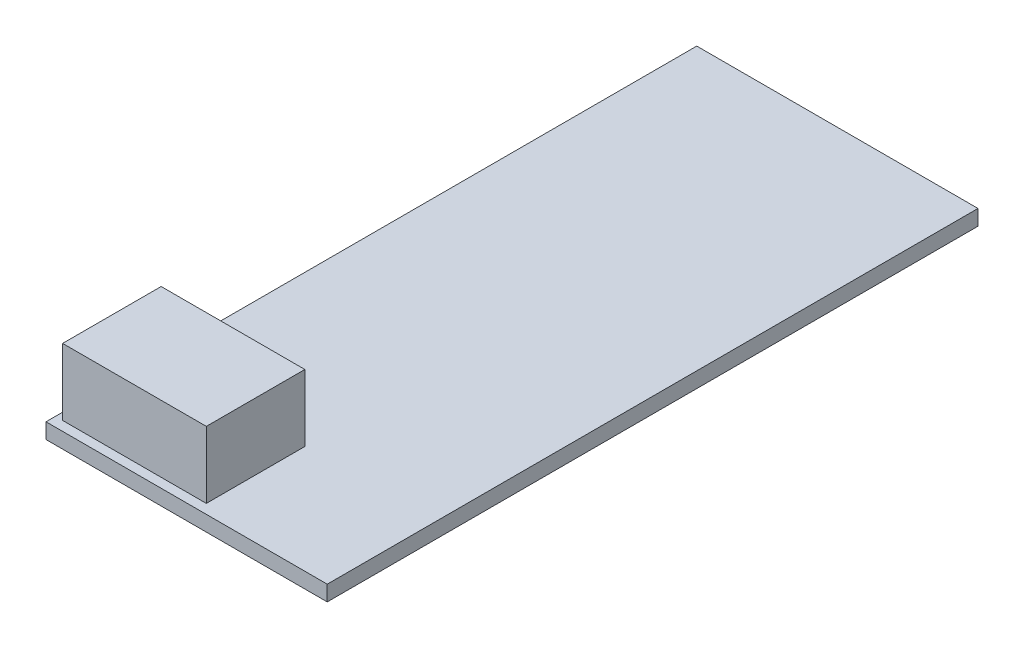
ISO-10303-21;
HEADER;
FILE_DESCRIPTION(('STEP AP214'),'2;1');
FILE_NAME('part.step','',(''),(''),'','','');
FILE_SCHEMA(('AUTOMOTIVE_DESIGN { 1 0 10303 214 1 1 1 1 }'));
ENDSEC;
DATA;
#1=APPLICATION_CONTEXT('core data for automotive mechanical design processes');
#2=APPLICATION_PROTOCOL_DEFINITION('international standard','automotive_design',2000,#1);
#3=PRODUCT_CONTEXT('',#1,'mechanical');
#4=PRODUCT('Part','Part','',(#3));
#5=PRODUCT_RELATED_PRODUCT_CATEGORY('part','',(#4));
#6=PRODUCT_DEFINITION_FORMATION('','',#4);
#7=PRODUCT_DEFINITION_CONTEXT('part definition',#1,'design');
#8=PRODUCT_DEFINITION('design','',#6,#7);
#9=PRODUCT_DEFINITION_SHAPE('','',#8);
#10=(LENGTH_UNIT() NAMED_UNIT(*) SI_UNIT(.MILLI.,.METRE.));
#11=(NAMED_UNIT(*) PLANE_ANGLE_UNIT() SI_UNIT($,.RADIAN.));
#12=(NAMED_UNIT(*) SI_UNIT($,.STERADIAN.) SOLID_ANGLE_UNIT());
#13=UNCERTAINTY_MEASURE_WITH_UNIT(LENGTH_MEASURE(1.E-05),#10,'distance_accuracy_value','');
#14=(GEOMETRIC_REPRESENTATION_CONTEXT(3) GLOBAL_UNCERTAINTY_ASSIGNED_CONTEXT((#13)) GLOBAL_UNIT_ASSIGNED_CONTEXT((#10,
#11,#12)) REPRESENTATION_CONTEXT('',''));
#15=CARTESIAN_POINT('',(0.,0.,0.));
#16=DIRECTION('',(0.,0.,1.));
#17=DIRECTION('',(1.,0.,0.));
#18=AXIS2_PLACEMENT_3D('',#15,#16,#17);
#19=CARTESIAN_POINT('',(0.,1.5,0.));
#20=DIRECTION('',(0.,-1.,0.));
#21=DIRECTION('',(0.,0.,-1.));
#22=AXIS2_PLACEMENT_3D('',#19,#20,#21);
#23=PLANE('',#22);
#24=DIRECTION('',(0.,0.,-1.));
#25=VECTOR('',#24,1.);
#26=CARTESIAN_POINT('',(13.7,1.5,31.7));
#27=LINE('',#26,#25);
#28=CARTESIAN_POINT('',(13.7,1.5,31.7));
#29=VERTEX_POINT('',#28);
#30=CARTESIAN_POINT('',(13.7,1.5,-31.7));
#31=VERTEX_POINT('',#30);
#32=EDGE_CURVE('E156',#29,#31,#27,.T.);
#33=ORIENTED_EDGE('',*,*,#32,.T.);
#34=DIRECTION('',(-1.,0.,0.));
#35=VECTOR('',#34,1.);
#36=CARTESIAN_POINT('',(-13.7,1.5,-31.7));
#37=LINE('',#36,#35);
#38=CARTESIAN_POINT('',(-13.7,1.5,-31.7));
#39=VERTEX_POINT('',#38);
#40=EDGE_CURVE('E160',#31,#39,#37,.T.);
#41=ORIENTED_EDGE('',*,*,#40,.T.);
#42=DIRECTION('',(0.,0.,1.));
#43=VECTOR('',#42,1.);
#44=CARTESIAN_POINT('',(-13.7,1.5,31.7));
#45=LINE('',#44,#43);
#46=CARTESIAN_POINT('',(-13.7,1.5,31.7));
#47=VERTEX_POINT('',#46);
#48=EDGE_CURVE('E164',#39,#47,#45,.T.);
#49=ORIENTED_EDGE('',*,*,#48,.T.);
#50=DIRECTION('',(1.,0.,0.));
#51=VECTOR('',#50,1.);
#52=CARTESIAN_POINT('',(-13.7,1.5,31.7));
#53=LINE('',#52,#51);
#54=EDGE_CURVE('E167',#47,#29,#53,.T.);
#55=ORIENTED_EDGE('',*,*,#54,.T.);
#56=EDGE_LOOP('',(#33,#41,#49,#55));
#57=FACE_BOUND('',#56,.T.);
#58=DIRECTION('',(0.,0.,-1.));
#59=VECTOR('',#58,1.);
#60=CARTESIAN_POINT('',(0.995538820845523,1.5,30.7761223841347));
#61=LINE('',#60,#59);
#62=CARTESIAN_POINT('',(0.995538820845523,1.5,30.7761223841347));
#63=VERTEX_POINT('',#62);
#64=CARTESIAN_POINT('',(0.995538820845523,1.5,21.1761223841347));
#65=VERTEX_POINT('',#64);
#66=EDGE_CURVE('E142',#63,#65,#61,.T.);
#67=ORIENTED_EDGE('',*,*,#66,.F.);
#68=DIRECTION('',(1.,0.,0.));
#69=VECTOR('',#68,1.);
#70=CARTESIAN_POINT('',(-13.0044611791545,1.5,30.7761223841347));
#71=LINE('',#70,#69);
#72=CARTESIAN_POINT('',(-13.0044611791545,1.5,30.7761223841347));
#73=VERTEX_POINT('',#72);
#74=EDGE_CURVE('E139',#73,#63,#71,.T.);
#75=ORIENTED_EDGE('',*,*,#74,.F.);
#76=DIRECTION('',(0.,0.,1.));
#77=VECTOR('',#76,1.);
#78=CARTESIAN_POINT('',(-13.0044611791545,1.5,30.7761223841347));
#79=LINE('',#78,#77);
#80=CARTESIAN_POINT('',(-13.0044611791545,1.5,21.1761223841347));
#81=VERTEX_POINT('',#80);
#82=EDGE_CURVE('E62',#81,#73,#79,.T.);
#83=ORIENTED_EDGE('',*,*,#82,.F.);
#84=DIRECTION('',(-1.,0.,0.));
#85=VECTOR('',#84,1.);
#86=CARTESIAN_POINT('',(-13.0044611791545,1.5,21.1761223841347));
#87=LINE('',#86,#85);
#88=EDGE_CURVE('E57',#65,#81,#87,.T.);
#89=ORIENTED_EDGE('',*,*,#88,.F.);
#90=EDGE_LOOP('',(#67,#75,#83,#89));
#91=FACE_BOUND('',#90,.T.);
#92=ADVANCED_FACE('F38',(#57,#91),#23,.F.);
#93=CARTESIAN_POINT('',(13.7,1.5,31.7));
#94=DIRECTION('',(-1.,0.,0.));
#95=DIRECTION('',(0.,0.,1.));
#96=AXIS2_PLACEMENT_3D('',#93,#94,#95);
#97=PLANE('',#96);
#98=DIRECTION('',(0.,0.,-1.));
#99=VECTOR('',#98,1.);
#100=CARTESIAN_POINT('',(13.7,0.,31.7));
#101=LINE('',#100,#99);
#102=CARTESIAN_POINT('',(13.7,0.,31.7));
#103=VERTEX_POINT('',#102);
#104=CARTESIAN_POINT('',(13.7,0.,-31.7));
#105=VERTEX_POINT('',#104);
#106=EDGE_CURVE('E144',#103,#105,#101,.T.);
#107=ORIENTED_EDGE('',*,*,#106,.T.);
#108=DIRECTION('',(0.,-1.,0.));
#109=VECTOR('',#108,1.);
#110=CARTESIAN_POINT('',(13.7,1.5,-31.7));
#111=LINE('',#110,#109);
#112=EDGE_CURVE('E11',#31,#105,#111,.T.);
#113=ORIENTED_EDGE('',*,*,#112,.F.);
#114=ORIENTED_EDGE('',*,*,#32,.F.);
#115=DIRECTION('',(0.,-1.,0.));
#116=VECTOR('',#115,1.);
#117=CARTESIAN_POINT('',(13.7,1.5,31.7));
#118=LINE('',#117,#116);
#119=EDGE_CURVE('E169',#29,#103,#118,.T.);
#120=ORIENTED_EDGE('',*,*,#119,.T.);
#121=EDGE_LOOP('',(#107,#113,#114,#120));
#122=FACE_BOUND('',#121,.T.);
#123=ADVANCED_FACE('F40',(#122),#97,.F.);
#124=CARTESIAN_POINT('',(-13.7,1.5,-31.7));
#125=DIRECTION('',(0.,0.,1.));
#126=DIRECTION('',(1.,0.,0.));
#127=AXIS2_PLACEMENT_3D('',#124,#125,#126);
#128=PLANE('',#127);
#129=DIRECTION('',(-1.,0.,0.));
#130=VECTOR('',#129,1.);
#131=CARTESIAN_POINT('',(-13.7,0.,-31.7));
#132=LINE('',#131,#130);
#133=CARTESIAN_POINT('',(-13.7,0.,-31.7));
#134=VERTEX_POINT('',#133);
#135=EDGE_CURVE('E150',#105,#134,#132,.T.);
#136=ORIENTED_EDGE('',*,*,#135,.T.);
#137=DIRECTION('',(0.,-1.,0.));
#138=VECTOR('',#137,1.);
#139=CARTESIAN_POINT('',(-13.7,1.5,-31.7));
#140=LINE('',#139,#138);
#141=EDGE_CURVE('E47',#39,#134,#140,.T.);
#142=ORIENTED_EDGE('',*,*,#141,.F.);
#143=ORIENTED_EDGE('',*,*,#40,.F.);
#144=ORIENTED_EDGE('',*,*,#112,.T.);
#145=EDGE_LOOP('',(#136,#142,#143,#144));
#146=FACE_BOUND('',#145,.T.);
#147=ADVANCED_FACE('F205',(#146),#128,.F.);
#148=CARTESIAN_POINT('',(-13.7,1.5,31.7));
#149=DIRECTION('',(1.,0.,0.));
#150=DIRECTION('',(0.,0.,-1.));
#151=AXIS2_PLACEMENT_3D('',#148,#149,#150);
#152=PLANE('',#151);
#153=DIRECTION('',(0.,0.,1.));
#154=VECTOR('',#153,1.);
#155=CARTESIAN_POINT('',(-13.7,0.,31.7));
#156=LINE('',#155,#154);
#157=CARTESIAN_POINT('',(-13.7,0.,31.7));
#158=VERTEX_POINT('',#157);
#159=EDGE_CURVE('E173',#134,#158,#156,.T.);
#160=ORIENTED_EDGE('',*,*,#159,.T.);
#161=DIRECTION('',(0.,-1.,0.));
#162=VECTOR('',#161,1.);
#163=CARTESIAN_POINT('',(-13.7,1.5,31.7));
#164=LINE('',#163,#162);
#165=EDGE_CURVE('E181',#47,#158,#164,.T.);
#166=ORIENTED_EDGE('',*,*,#165,.F.);
#167=ORIENTED_EDGE('',*,*,#48,.F.);
#168=ORIENTED_EDGE('',*,*,#141,.T.);
#169=EDGE_LOOP('',(#160,#166,#167,#168));
#170=FACE_BOUND('',#169,.T.);
#171=ADVANCED_FACE('F190',(#170),#152,.F.);
#172=CARTESIAN_POINT('',(-13.7,1.5,31.7));
#173=DIRECTION('',(0.,0.,-1.));
#174=DIRECTION('',(-1.,0.,0.));
#175=AXIS2_PLACEMENT_3D('',#172,#173,#174);
#176=PLANE('',#175);
#177=DIRECTION('',(1.,0.,0.));
#178=VECTOR('',#177,1.);
#179=CARTESIAN_POINT('',(-13.7,0.,31.7));
#180=LINE('',#179,#178);
#181=EDGE_CURVE('E161',#158,#103,#180,.T.);
#182=ORIENTED_EDGE('',*,*,#181,.T.);
#183=ORIENTED_EDGE('',*,*,#119,.F.);
#184=ORIENTED_EDGE('',*,*,#54,.F.);
#185=ORIENTED_EDGE('',*,*,#165,.T.);
#186=EDGE_LOOP('',(#182,#183,#184,#185));
#187=FACE_BOUND('',#186,.T.);
#188=ADVANCED_FACE('F199',(#187),#176,.F.);
#189=CARTESIAN_POINT('',(0.,0.,0.));
#190=DIRECTION('',(0.,-1.,0.));
#191=DIRECTION('',(0.,0.,-1.));
#192=AXIS2_PLACEMENT_3D('',#189,#190,#191);
#193=PLANE('',#192);
#194=ORIENTED_EDGE('',*,*,#106,.F.);
#195=ORIENTED_EDGE('',*,*,#181,.F.);
#196=ORIENTED_EDGE('',*,*,#159,.F.);
#197=ORIENTED_EDGE('',*,*,#135,.F.);
#198=EDGE_LOOP('',(#194,#195,#196,#197));
#199=FACE_BOUND('',#198,.T.);
#200=ADVANCED_FACE('F196',(#199),#193,.T.);
#201=CARTESIAN_POINT('',(0.995538820845523,8.,30.7761223841347));
#202=DIRECTION('',(-1.,0.,0.));
#203=DIRECTION('',(0.,0.,1.));
#204=AXIS2_PLACEMENT_3D('',#201,#202,#203);
#205=PLANE('',#204);
#206=ORIENTED_EDGE('',*,*,#66,.T.);
#207=DIRECTION('',(0.,-1.,0.));
#208=VECTOR('',#207,1.);
#209=CARTESIAN_POINT('',(0.995538820845523,8.,21.1761223841347));
#210=LINE('',#209,#208);
#211=CARTESIAN_POINT('',(0.995538820845523,8.,21.1761223841347));
#212=VERTEX_POINT('',#211);
#213=EDGE_CURVE('E121',#212,#65,#210,.T.);
#214=ORIENTED_EDGE('',*,*,#213,.F.);
#215=DIRECTION('',(0.,0.,-1.));
#216=VECTOR('',#215,1.);
#217=CARTESIAN_POINT('',(0.995538820845523,8.,30.7761223841347));
#218=LINE('',#217,#216);
#219=CARTESIAN_POINT('',(0.995538820845523,8.,30.7761223841347));
#220=VERTEX_POINT('',#219);
#221=EDGE_CURVE('E129',#220,#212,#218,.T.);
#222=ORIENTED_EDGE('',*,*,#221,.F.);
#223=DIRECTION('',(0.,-1.,0.));
#224=VECTOR('',#223,1.);
#225=CARTESIAN_POINT('',(0.995538820845523,8.,30.7761223841347));
#226=LINE('',#225,#224);
#227=EDGE_CURVE('E307',#220,#63,#226,.T.);
#228=ORIENTED_EDGE('',*,*,#227,.T.);
#229=EDGE_LOOP('',(#206,#214,#222,#228));
#230=FACE_BOUND('',#229,.T.);
#231=ADVANCED_FACE('F141',(#230),#205,.F.);
#232=CARTESIAN_POINT('',(-13.0044611791545,8.,21.1761223841347));
#233=DIRECTION('',(0.,0.,1.));
#234=DIRECTION('',(1.,0.,0.));
#235=AXIS2_PLACEMENT_3D('',#232,#233,#234);
#236=PLANE('',#235);
#237=ORIENTED_EDGE('',*,*,#88,.T.);
#238=DIRECTION('',(0.,-1.,0.));
#239=VECTOR('',#238,1.);
#240=CARTESIAN_POINT('',(-13.0044611791545,8.,21.1761223841347));
#241=LINE('',#240,#239);
#242=CARTESIAN_POINT('',(-13.0044611791545,8.,21.1761223841347));
#243=VERTEX_POINT('',#242);
#244=EDGE_CURVE('E124',#243,#81,#241,.T.);
#245=ORIENTED_EDGE('',*,*,#244,.F.);
#246=DIRECTION('',(-1.,0.,0.));
#247=VECTOR('',#246,1.);
#248=CARTESIAN_POINT('',(-13.0044611791545,8.,21.1761223841347));
#249=LINE('',#248,#247);
#250=EDGE_CURVE('E117',#212,#243,#249,.T.);
#251=ORIENTED_EDGE('',*,*,#250,.F.);
#252=ORIENTED_EDGE('',*,*,#213,.T.);
#253=EDGE_LOOP('',(#237,#245,#251,#252));
#254=FACE_BOUND('',#253,.T.);
#255=ADVANCED_FACE('F119',(#254),#236,.F.);
#256=CARTESIAN_POINT('',(-13.0044611791545,8.,30.7761223841347));
#257=DIRECTION('',(1.,0.,0.));
#258=DIRECTION('',(0.,0.,-1.));
#259=AXIS2_PLACEMENT_3D('',#256,#257,#258);
#260=PLANE('',#259);
#261=ORIENTED_EDGE('',*,*,#82,.T.);
#262=DIRECTION('',(0.,-1.,0.));
#263=VECTOR('',#262,1.);
#264=CARTESIAN_POINT('',(-13.0044611791545,8.,30.7761223841347));
#265=LINE('',#264,#263);
#266=CARTESIAN_POINT('',(-13.0044611791545,8.,30.7761223841347));
#267=VERTEX_POINT('',#266);
#268=EDGE_CURVE('E152',#267,#73,#265,.T.);
#269=ORIENTED_EDGE('',*,*,#268,.F.);
#270=DIRECTION('',(0.,0.,1.));
#271=VECTOR('',#270,1.);
#272=CARTESIAN_POINT('',(-13.0044611791545,8.,30.7761223841347));
#273=LINE('',#272,#271);
#274=EDGE_CURVE('E128',#243,#267,#273,.T.);
#275=ORIENTED_EDGE('',*,*,#274,.F.);
#276=ORIENTED_EDGE('',*,*,#244,.T.);
#277=EDGE_LOOP('',(#261,#269,#275,#276));
#278=FACE_BOUND('',#277,.T.);
#279=ADVANCED_FACE('F244',(#278),#260,.F.);
#280=CARTESIAN_POINT('',(-13.0044611791545,8.,30.7761223841347));
#281=DIRECTION('',(0.,0.,-1.));
#282=DIRECTION('',(-1.,0.,0.));
#283=AXIS2_PLACEMENT_3D('',#280,#281,#282);
#284=PLANE('',#283);
#285=ORIENTED_EDGE('',*,*,#74,.T.);
#286=ORIENTED_EDGE('',*,*,#227,.F.);
#287=DIRECTION('',(1.,0.,0.));
#288=VECTOR('',#287,1.);
#289=CARTESIAN_POINT('',(-13.0044611791545,8.,30.7761223841347));
#290=LINE('',#289,#288);
#291=EDGE_CURVE('E134',#267,#220,#290,.T.);
#292=ORIENTED_EDGE('',*,*,#291,.F.);
#293=ORIENTED_EDGE('',*,*,#268,.T.);
#294=EDGE_LOOP('',(#285,#286,#292,#293));
#295=FACE_BOUND('',#294,.T.);
#296=ADVANCED_FACE('F248',(#295),#284,.F.);
#297=CARTESIAN_POINT('',(0.,8.,0.));
#298=DIRECTION('',(0.,-1.,0.));
#299=DIRECTION('',(0.,0.,-1.));
#300=AXIS2_PLACEMENT_3D('',#297,#298,#299);
#301=PLANE('',#300);
#302=ORIENTED_EDGE('',*,*,#221,.T.);
#303=ORIENTED_EDGE('',*,*,#250,.T.);
#304=ORIENTED_EDGE('',*,*,#274,.T.);
#305=ORIENTED_EDGE('',*,*,#291,.T.);
#306=EDGE_LOOP('',(#302,#303,#304,#305));
#307=FACE_BOUND('',#306,.T.);
#308=ADVANCED_FACE('F132',(#307),#301,.F.);
#309=CLOSED_SHELL('',(#92,#123,#147,#171,#188,#200,#231,#255,#279,#296,#308));
#310=MANIFOLD_SOLID_BREP('B2',#309);
#311=ADVANCED_BREP_SHAPE_REPRESENTATION('',(#18,#310),#14);
#312=SHAPE_DEFINITION_REPRESENTATION(#9,#311);
ENDSEC;
END-ISO-10303-21;
